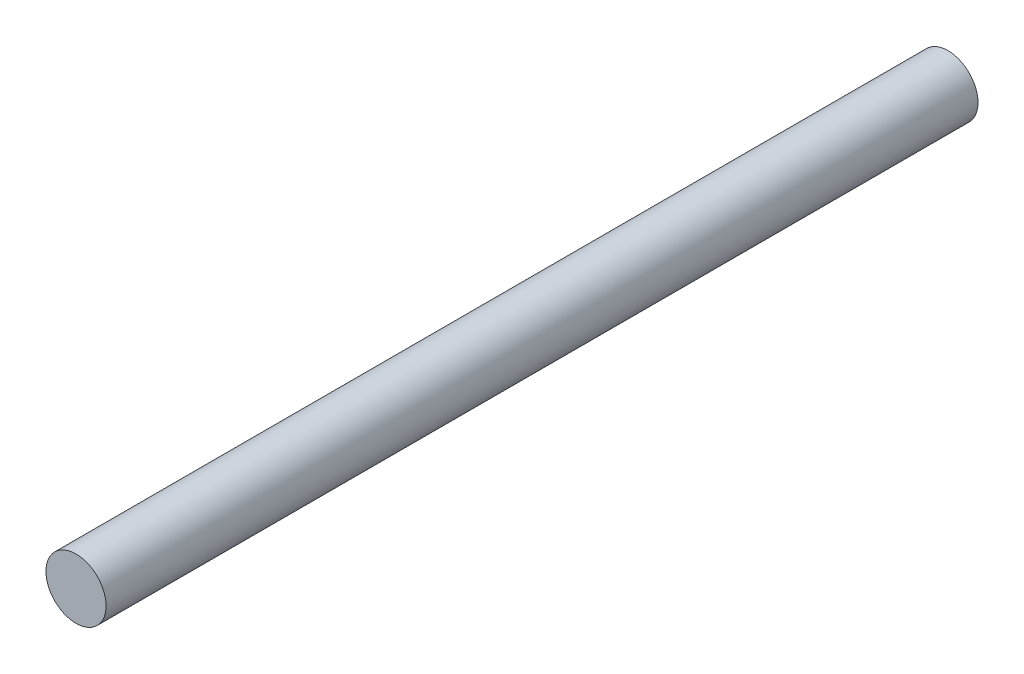
ISO-10303-21;
HEADER;
FILE_DESCRIPTION(('STEP AP214'),'2;1');
FILE_NAME('part.step','',(''),(''),'','','');
FILE_SCHEMA(('AUTOMOTIVE_DESIGN { 1 0 10303 214 1 1 1 1 }'));
ENDSEC;
DATA;
#1=APPLICATION_CONTEXT('core data for automotive mechanical design processes');
#2=APPLICATION_PROTOCOL_DEFINITION('international standard','automotive_design',2000,#1);
#3=PRODUCT_CONTEXT('',#1,'mechanical');
#4=PRODUCT('Part','Part','',(#3));
#5=PRODUCT_RELATED_PRODUCT_CATEGORY('part','',(#4));
#6=PRODUCT_DEFINITION_FORMATION('','',#4);
#7=PRODUCT_DEFINITION_CONTEXT('part definition',#1,'design');
#8=PRODUCT_DEFINITION('design','',#6,#7);
#9=PRODUCT_DEFINITION_SHAPE('','',#8);
#10=(LENGTH_UNIT() NAMED_UNIT(*) SI_UNIT(.MILLI.,.METRE.));
#11=(NAMED_UNIT(*) PLANE_ANGLE_UNIT() SI_UNIT($,.RADIAN.));
#12=(NAMED_UNIT(*) SI_UNIT($,.STERADIAN.) SOLID_ANGLE_UNIT());
#13=UNCERTAINTY_MEASURE_WITH_UNIT(LENGTH_MEASURE(1.E-05),#10,'distance_accuracy_value','');
#14=(GEOMETRIC_REPRESENTATION_CONTEXT(3) GLOBAL_UNCERTAINTY_ASSIGNED_CONTEXT((#13)) GLOBAL_UNIT_ASSIGNED_CONTEXT((#10,
#11,#12)) REPRESENTATION_CONTEXT('',''));
#15=CARTESIAN_POINT('',(0.,0.,0.));
#16=DIRECTION('',(0.,0.,1.));
#17=DIRECTION('',(1.,0.,0.));
#18=AXIS2_PLACEMENT_3D('',#15,#16,#17);
#19=CARTESIAN_POINT('',(0.,0.,14.5));
#20=DIRECTION('',(0.,0.,-1.));
#21=DIRECTION('',(-1.,0.,0.));
#22=AXIS2_PLACEMENT_3D('',#19,#20,#21);
#23=CYLINDRICAL_SURFACE('',#22,0.5);
#24=CARTESIAN_POINT('',(0.,0.,14.5));
#25=DIRECTION('',(0.,0.,1.));
#26=DIRECTION('',(1.,0.,0.));
#27=AXIS2_PLACEMENT_3D('',#24,#25,#26);
#28=CIRCLE('',#27,0.5);
#29=CARTESIAN_POINT('',(0.5,0.,14.5));
#30=VERTEX_POINT('',#29);
#31=EDGE_CURVE('E10',#30,#30,#28,.T.);
#32=ORIENTED_EDGE('',*,*,#31,.F.);
#33=EDGE_LOOP('',(#32));
#34=FACE_BOUND('',#33,.T.);
#35=CARTESIAN_POINT('',(0.,0.,0.));
#36=DIRECTION('',(0.,0.,1.));
#37=DIRECTION('',(1.,0.,0.));
#38=AXIS2_PLACEMENT_3D('',#35,#36,#37);
#39=CIRCLE('',#38,0.5);
#40=CARTESIAN_POINT('',(0.5,0.,0.));
#41=VERTEX_POINT('',#40);
#42=EDGE_CURVE('E34',#41,#41,#39,.T.);
#43=ORIENTED_EDGE('',*,*,#42,.T.);
#44=EDGE_LOOP('',(#43));
#45=FACE_BOUND('',#44,.T.);
#46=ADVANCED_FACE('F31',(#34,#45),#23,.T.);
#47=CARTESIAN_POINT('',(0.,0.,14.5));
#48=DIRECTION('',(0.,0.,1.));
#49=DIRECTION('',(1.,0.,0.));
#50=AXIS2_PLACEMENT_3D('',#47,#48,#49);
#51=PLANE('',#50);
#52=ORIENTED_EDGE('',*,*,#31,.T.);
#53=EDGE_LOOP('',(#52));
#54=FACE_BOUND('',#53,.T.);
#55=ADVANCED_FACE('F46',(#54),#51,.T.);
#56=CARTESIAN_POINT('',(0.,0.,0.));
#57=DIRECTION('',(0.,0.,1.));
#58=DIRECTION('',(1.,0.,0.));
#59=AXIS2_PLACEMENT_3D('',#56,#57,#58);
#60=PLANE('',#59);
#61=ORIENTED_EDGE('',*,*,#42,.F.);
#62=EDGE_LOOP('',(#61));
#63=FACE_BOUND('',#62,.T.);
#64=ADVANCED_FACE('F44',(#63),#60,.F.);
#65=CLOSED_SHELL('',(#46,#55,#64));
#66=MANIFOLD_SOLID_BREP('B2',#65);
#67=ADVANCED_BREP_SHAPE_REPRESENTATION('',(#18,#66),#14);
#68=SHAPE_DEFINITION_REPRESENTATION(#9,#67);
ENDSEC;
END-ISO-10303-21;
